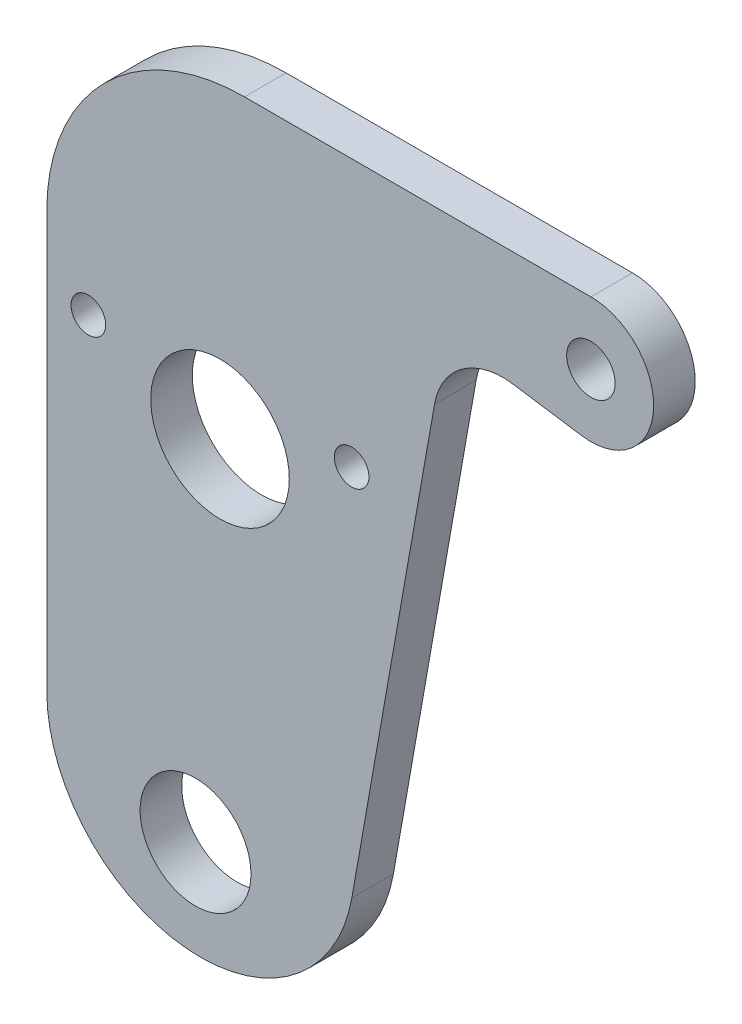
ISO-10303-21;
HEADER;
FILE_DESCRIPTION(('STEP AP214'),'2;1');
FILE_NAME('part.step','',(''),(''),'','','');
FILE_SCHEMA(('AUTOMOTIVE_DESIGN { 1 0 10303 214 1 1 1 1 }'));
ENDSEC;
DATA;
#1=APPLICATION_CONTEXT('core data for automotive mechanical design processes');
#2=APPLICATION_PROTOCOL_DEFINITION('international standard','automotive_design',2000,#1);
#3=PRODUCT_CONTEXT('',#1,'mechanical');
#4=PRODUCT('Part','Part','',(#3));
#5=PRODUCT_RELATED_PRODUCT_CATEGORY('part','',(#4));
#6=PRODUCT_DEFINITION_FORMATION('','',#4);
#7=PRODUCT_DEFINITION_CONTEXT('part definition',#1,'design');
#8=PRODUCT_DEFINITION('design','',#6,#7);
#9=PRODUCT_DEFINITION_SHAPE('','',#8);
#10=(LENGTH_UNIT() NAMED_UNIT(*) SI_UNIT(.MILLI.,.METRE.));
#11=(NAMED_UNIT(*) PLANE_ANGLE_UNIT() SI_UNIT($,.RADIAN.));
#12=(NAMED_UNIT(*) SI_UNIT($,.STERADIAN.) SOLID_ANGLE_UNIT());
#13=UNCERTAINTY_MEASURE_WITH_UNIT(LENGTH_MEASURE(1.E-05),#10,'distance_accuracy_value','');
#14=(GEOMETRIC_REPRESENTATION_CONTEXT(3) GLOBAL_UNCERTAINTY_ASSIGNED_CONTEXT((#13)) GLOBAL_UNIT_ASSIGNED_CONTEXT((#10,
#11,#12)) REPRESENTATION_CONTEXT('',''));
#15=CARTESIAN_POINT('',(0.,0.,0.));
#16=DIRECTION('',(0.,0.,1.));
#17=DIRECTION('',(1.,0.,0.));
#18=AXIS2_PLACEMENT_3D('',#15,#16,#17);
#19=CARTESIAN_POINT('',(-1.40800828095821,-15.,3.));
#20=DIRECTION('',(0.,0.,1.));
#21=DIRECTION('',(1.,0.,0.));
#22=AXIS2_PLACEMENT_3D('',#19,#20,#21);
#23=PLANE('',#22);
#24=CARTESIAN_POINT('',(26.7667788981174,24.7387140079105,3.));
#25=DIRECTION('',(0.,0.,1.));
#26=DIRECTION('',(1.,0.,0.));
#27=AXIS2_PLACEMENT_3D('',#24,#25,#26);
#28=CIRCLE('',#27,1.75);
#29=CARTESIAN_POINT('',(28.5167788981174,24.7387140079105,3.));
#30=VERTEX_POINT('',#29);
#31=EDGE_CURVE('E206',#30,#30,#28,.T.);
#32=ORIENTED_EDGE('',*,*,#31,.F.);
#33=EDGE_LOOP('',(#32));
#34=FACE_BOUND('',#33,.T.);
#35=CARTESIAN_POINT('',(-9.5,10.,3.));
#36=DIRECTION('',(0.,0.,1.));
#37=DIRECTION('',(1.,0.,0.));
#38=AXIS2_PLACEMENT_3D('',#35,#36,#37);
#39=CIRCLE('',#38,1.25);
#40=CARTESIAN_POINT('',(-8.25,10.,3.));
#41=VERTEX_POINT('',#40);
#42=EDGE_CURVE('E201',#41,#41,#39,.T.);
#43=ORIENTED_EDGE('',*,*,#42,.F.);
#44=EDGE_LOOP('',(#43));
#45=FACE_BOUND('',#44,.T.);
#46=CARTESIAN_POINT('',(9.5,10.,3.));
#47=DIRECTION('',(0.,0.,1.));
#48=DIRECTION('',(1.,0.,0.));
#49=AXIS2_PLACEMENT_3D('',#46,#47,#48);
#50=CIRCLE('',#49,1.25);
#51=CARTESIAN_POINT('',(10.75,10.,3.));
#52=VERTEX_POINT('',#51);
#53=EDGE_CURVE('E198',#52,#52,#50,.T.);
#54=ORIENTED_EDGE('',*,*,#53,.F.);
#55=EDGE_LOOP('',(#54));
#56=FACE_BOUND('',#55,.T.);
#57=CARTESIAN_POINT('',(0.,7.,3.));
#58=DIRECTION('',(0.,0.,1.));
#59=DIRECTION('',(1.,0.,0.));
#60=AXIS2_PLACEMENT_3D('',#57,#58,#59);
#61=CIRCLE('',#60,5.);
#62=CARTESIAN_POINT('',(5.,7.,3.));
#63=VERTEX_POINT('',#62);
#64=EDGE_CURVE('E191',#63,#63,#61,.T.);
#65=ORIENTED_EDGE('',*,*,#64,.F.);
#66=EDGE_LOOP('',(#65));
#67=FACE_BOUND('',#66,.T.);
#68=CARTESIAN_POINT('',(-1.40800828095821,-15.,3.));
#69=DIRECTION('',(0.,0.,1.));
#70=DIRECTION('',(1.,0.,0.));
#71=AXIS2_PLACEMENT_3D('',#68,#69,#70);
#72=CIRCLE('',#71,11.0919917190418);
#73=CARTESIAN_POINT('',(-12.5,-15.,3.));
#74=VERTEX_POINT('',#73);
#75=CARTESIAN_POINT('',(9.51547116030137,-16.9261041487082,3.));
#76=VERTEX_POINT('',#75);
#77=EDGE_CURVE('E148',#74,#76,#72,.T.);
#78=ORIENTED_EDGE('',*,*,#77,.T.);
#79=DIRECTION('',(0.173648177666924,0.984807753012209,0.));
#80=VECTOR('',#79,1.);
#81=CARTESIAN_POINT('',(15.4845288396986,16.9261041487082,3.));
#82=LINE('',#81,#80);
#83=CARTESIAN_POINT('',(15.4845288396986,16.9261041487082,3.));
#84=VERTEX_POINT('',#83);
#85=EDGE_CURVE('E96',#76,#84,#82,.T.);
#86=ORIENTED_EDGE('',*,*,#85,.T.);
#87=CARTESIAN_POINT('',(20.4085676047597,16.0578632603736,3.));
#88=DIRECTION('',(0.,0.,-1.));
#89=DIRECTION('',(1.,0.,0.));
#90=AXIS2_PLACEMENT_3D('',#87,#88,#89);
#91=CIRCLE('',#90,5.);
#92=CARTESIAN_POINT('',(21.1503450956942,21.0025337401875,3.));
#93=VERTEX_POINT('',#92);
#94=EDGE_CURVE('E163',#84,#93,#91,.T.);
#95=ORIENTED_EDGE('',*,*,#94,.T.);
#96=DIRECTION('',(0.988934095962776,-0.148355498186913,0.));
#97=VECTOR('',#96,1.);
#98=CARTESIAN_POINT('',(26.0950155755081,20.2607562492529,3.));
#99=LINE('',#98,#97);
#100=CARTESIAN_POINT('',(26.0950155755081,20.2607562492529,3.));
#101=VERTEX_POINT('',#100);
#102=EDGE_CURVE('E176',#93,#101,#99,.T.);
#103=ORIENTED_EDGE('',*,*,#102,.T.);
#104=CARTESIAN_POINT('',(26.7667788981174,24.7387140079105,3.));
#105=DIRECTION('',(0.,0.,1.));
#106=DIRECTION('',(-1.,0.,0.));
#107=AXIS2_PLACEMENT_3D('',#104,#105,#106);
#108=CIRCLE('',#107,4.52806489020693);
#109=CARTESIAN_POINT('',(26.7667788981174,29.2667788981174,3.));
#110=VERTEX_POINT('',#109);
#111=EDGE_CURVE('E115',#101,#110,#108,.T.);
#112=ORIENTED_EDGE('',*,*,#111,.T.);
#113=DIRECTION('',(-1.,0.,0.));
#114=VECTOR('',#113,1.);
#115=CARTESIAN_POINT('',(1.76677889811743,29.2667788981174,3.));
#116=LINE('',#115,#114);
#117=CARTESIAN_POINT('',(1.76677889811743,29.2667788981174,3.));
#118=VERTEX_POINT('',#117);
#119=EDGE_CURVE('E109',#110,#118,#116,.T.);
#120=ORIENTED_EDGE('',*,*,#119,.T.);
#121=CARTESIAN_POINT('',(1.76677889811743,15.,3.));
#122=DIRECTION('',(0.,0.,1.));
#123=DIRECTION('',(-1.,0.,0.));
#124=AXIS2_PLACEMENT_3D('',#121,#122,#123);
#125=CIRCLE('',#124,14.2667788981174);
#126=CARTESIAN_POINT('',(-12.5,15.,3.));
#127=VERTEX_POINT('',#126);
#128=EDGE_CURVE('E113',#118,#127,#125,.T.);
#129=ORIENTED_EDGE('',*,*,#128,.T.);
#130=DIRECTION('',(0.,-1.,0.));
#131=VECTOR('',#130,1.);
#132=CARTESIAN_POINT('',(-12.5,-15.,3.));
#133=LINE('',#132,#131);
#134=EDGE_CURVE('E53',#127,#74,#133,.T.);
#135=ORIENTED_EDGE('',*,*,#134,.T.);
#136=EDGE_LOOP('',(#78,#86,#95,#103,#112,#120,#129,#135));
#137=FACE_BOUND('',#136,.T.);
#138=CARTESIAN_POINT('',(-1.76464885854855,-19.0764204551448,3.));
#139=DIRECTION('',(0.,0.,1.));
#140=DIRECTION('',(1.,0.,0.));
#141=AXIS2_PLACEMENT_3D('',#138,#139,#140);
#142=CIRCLE('',#141,4.);
#143=CARTESIAN_POINT('',(2.23535114145145,-19.0764204551448,3.));
#144=VERTEX_POINT('',#143);
#145=EDGE_CURVE('E137',#144,#144,#142,.T.);
#146=ORIENTED_EDGE('',*,*,#145,.F.);
#147=EDGE_LOOP('',(#146));
#148=FACE_BOUND('',#147,.T.);
#149=ADVANCED_FACE('F36',(#34,#45,#56,#67,#137,#148),#23,.T.);
#150=CARTESIAN_POINT('',(-1.40800828095821,-15.,0.));
#151=DIRECTION('',(0.,0.,1.));
#152=DIRECTION('',(1.,0.,0.));
#153=AXIS2_PLACEMENT_3D('',#150,#151,#152);
#154=PLANE('',#153);
#155=CARTESIAN_POINT('',(26.7667788981174,24.7387140079105,0.));
#156=DIRECTION('',(0.,0.,1.));
#157=DIRECTION('',(1.,0.,0.));
#158=AXIS2_PLACEMENT_3D('',#155,#156,#157);
#159=CIRCLE('',#158,1.75);
#160=CARTESIAN_POINT('',(28.5167788981174,24.7387140079105,0.));
#161=VERTEX_POINT('',#160);
#162=EDGE_CURVE('E192',#161,#161,#159,.T.);
#163=ORIENTED_EDGE('',*,*,#162,.T.);
#164=EDGE_LOOP('',(#163));
#165=FACE_BOUND('',#164,.T.);
#166=CARTESIAN_POINT('',(-9.5,10.,0.));
#167=DIRECTION('',(0.,0.,1.));
#168=DIRECTION('',(1.,0.,0.));
#169=AXIS2_PLACEMENT_3D('',#166,#167,#168);
#170=CIRCLE('',#169,1.25);
#171=CARTESIAN_POINT('',(-8.25,10.,0.));
#172=VERTEX_POINT('',#171);
#173=EDGE_CURVE('E185',#172,#172,#170,.T.);
#174=ORIENTED_EDGE('',*,*,#173,.T.);
#175=EDGE_LOOP('',(#174));
#176=FACE_BOUND('',#175,.T.);
#177=CARTESIAN_POINT('',(9.5,10.,0.));
#178=DIRECTION('',(0.,0.,1.));
#179=DIRECTION('',(1.,0.,0.));
#180=AXIS2_PLACEMENT_3D('',#177,#178,#179);
#181=CIRCLE('',#180,1.25);
#182=CARTESIAN_POINT('',(10.75,10.,0.));
#183=VERTEX_POINT('',#182);
#184=EDGE_CURVE('E195',#183,#183,#181,.T.);
#185=ORIENTED_EDGE('',*,*,#184,.T.);
#186=EDGE_LOOP('',(#185));
#187=FACE_BOUND('',#186,.T.);
#188=CARTESIAN_POINT('',(0.,7.,0.));
#189=DIRECTION('',(0.,0.,1.));
#190=DIRECTION('',(1.,0.,0.));
#191=AXIS2_PLACEMENT_3D('',#188,#189,#190);
#192=CIRCLE('',#191,5.);
#193=CARTESIAN_POINT('',(5.,7.,0.));
#194=VERTEX_POINT('',#193);
#195=EDGE_CURVE('E188',#194,#194,#192,.T.);
#196=ORIENTED_EDGE('',*,*,#195,.T.);
#197=EDGE_LOOP('',(#196));
#198=FACE_BOUND('',#197,.T.);
#199=CARTESIAN_POINT('',(-1.40800828095821,-15.,0.));
#200=DIRECTION('',(0.,0.,1.));
#201=DIRECTION('',(1.,0.,0.));
#202=AXIS2_PLACEMENT_3D('',#199,#200,#201);
#203=CIRCLE('',#202,11.0919917190418);
#204=CARTESIAN_POINT('',(-12.5,-15.,0.));
#205=VERTEX_POINT('',#204);
#206=CARTESIAN_POINT('',(9.51547116030137,-16.9261041487082,0.));
#207=VERTEX_POINT('',#206);
#208=EDGE_CURVE('E133',#205,#207,#203,.T.);
#209=ORIENTED_EDGE('',*,*,#208,.F.);
#210=DIRECTION('',(0.,-1.,0.));
#211=VECTOR('',#210,1.);
#212=CARTESIAN_POINT('',(-12.5,-15.,0.));
#213=LINE('',#212,#211);
#214=CARTESIAN_POINT('',(-12.5,15.,0.));
#215=VERTEX_POINT('',#214);
#216=EDGE_CURVE('E88',#215,#205,#213,.T.);
#217=ORIENTED_EDGE('',*,*,#216,.F.);
#218=CARTESIAN_POINT('',(1.76677889811743,15.,0.));
#219=DIRECTION('',(0.,0.,1.));
#220=DIRECTION('',(-1.,0.,0.));
#221=AXIS2_PLACEMENT_3D('',#218,#219,#220);
#222=CIRCLE('',#221,14.2667788981174);
#223=CARTESIAN_POINT('',(1.76677889811743,29.2667788981174,0.));
#224=VERTEX_POINT('',#223);
#225=EDGE_CURVE('E82',#224,#215,#222,.T.);
#226=ORIENTED_EDGE('',*,*,#225,.F.);
#227=DIRECTION('',(-1.,0.,0.));
#228=VECTOR('',#227,1.);
#229=CARTESIAN_POINT('',(1.76677889811743,29.2667788981174,0.));
#230=LINE('',#229,#228);
#231=CARTESIAN_POINT('',(26.7667788981174,29.2667788981174,0.));
#232=VERTEX_POINT('',#231);
#233=EDGE_CURVE('E123',#232,#224,#230,.T.);
#234=ORIENTED_EDGE('',*,*,#233,.F.);
#235=CARTESIAN_POINT('',(26.7667788981174,24.7387140079105,0.));
#236=DIRECTION('',(0.,0.,1.));
#237=DIRECTION('',(-1.,0.,0.));
#238=AXIS2_PLACEMENT_3D('',#235,#236,#237);
#239=CIRCLE('',#238,4.52806489020693);
#240=CARTESIAN_POINT('',(26.0950155755081,20.2607562492529,0.));
#241=VERTEX_POINT('',#240);
#242=EDGE_CURVE('E143',#241,#232,#239,.T.);
#243=ORIENTED_EDGE('',*,*,#242,.F.);
#244=DIRECTION('',(0.988934095962776,-0.148355498186913,0.));
#245=VECTOR('',#244,1.);
#246=CARTESIAN_POINT('',(26.0950155755081,20.2607562492529,0.));
#247=LINE('',#246,#245);
#248=CARTESIAN_POINT('',(21.1503450956942,21.0025337401875,0.));
#249=VERTEX_POINT('',#248);
#250=EDGE_CURVE('E141',#249,#241,#247,.T.);
#251=ORIENTED_EDGE('',*,*,#250,.F.);
#252=CARTESIAN_POINT('',(20.4085676047597,16.0578632603736,0.));
#253=DIRECTION('',(0.,0.,-1.));
#254=DIRECTION('',(1.,0.,0.));
#255=AXIS2_PLACEMENT_3D('',#252,#253,#254);
#256=CIRCLE('',#255,5.);
#257=CARTESIAN_POINT('',(15.4845288396986,16.9261041487082,0.));
#258=VERTEX_POINT('',#257);
#259=EDGE_CURVE('E139',#258,#249,#256,.T.);
#260=ORIENTED_EDGE('',*,*,#259,.F.);
#261=DIRECTION('',(0.173648177666924,0.984807753012209,0.));
#262=VECTOR('',#261,1.);
#263=CARTESIAN_POINT('',(15.4845288396986,16.9261041487082,0.));
#264=LINE('',#263,#262);
#265=EDGE_CURVE('E136',#207,#258,#264,.T.);
#266=ORIENTED_EDGE('',*,*,#265,.F.);
#267=EDGE_LOOP('',(#209,#217,#226,#234,#243,#251,#260,#266));
#268=FACE_BOUND('',#267,.T.);
#269=CARTESIAN_POINT('',(-1.76464885854855,-19.0764204551448,0.));
#270=DIRECTION('',(0.,0.,1.));
#271=DIRECTION('',(1.,0.,0.));
#272=AXIS2_PLACEMENT_3D('',#269,#270,#271);
#273=CIRCLE('',#272,4.);
#274=CARTESIAN_POINT('',(2.23535114145145,-19.0764204551448,0.));
#275=VERTEX_POINT('',#274);
#276=EDGE_CURVE('E182',#275,#275,#273,.T.);
#277=ORIENTED_EDGE('',*,*,#276,.T.);
#278=EDGE_LOOP('',(#277));
#279=FACE_BOUND('',#278,.T.);
#280=ADVANCED_FACE('F167',(#165,#176,#187,#198,#268,#279),#154,.F.);
#281=CARTESIAN_POINT('',(-1.40800828095821,-15.,3.));
#282=DIRECTION('',(0.,0.,-1.));
#283=DIRECTION('',(-1.,0.,0.));
#284=AXIS2_PLACEMENT_3D('',#281,#282,#283);
#285=CYLINDRICAL_SURFACE('',#284,11.0919917190418);
#286=ORIENTED_EDGE('',*,*,#208,.T.);
#287=DIRECTION('',(0.,0.,-1.));
#288=VECTOR('',#287,1.);
#289=CARTESIAN_POINT('',(9.51547116030137,-16.9261041487082,3.));
#290=LINE('',#289,#288);
#291=EDGE_CURVE('E11',#76,#207,#290,.T.);
#292=ORIENTED_EDGE('',*,*,#291,.F.);
#293=ORIENTED_EDGE('',*,*,#77,.F.);
#294=DIRECTION('',(0.,0.,-1.));
#295=VECTOR('',#294,1.);
#296=CARTESIAN_POINT('',(-12.5,-15.,3.));
#297=LINE('',#296,#295);
#298=EDGE_CURVE('E129',#74,#205,#297,.T.);
#299=ORIENTED_EDGE('',*,*,#298,.T.);
#300=EDGE_LOOP('',(#286,#292,#293,#299));
#301=FACE_BOUND('',#300,.T.);
#302=ADVANCED_FACE('F38',(#301),#285,.T.);
#303=CARTESIAN_POINT('',(15.4845288396986,16.9261041487082,3.));
#304=DIRECTION('',(-0.984807753012209,0.173648177666924,0.));
#305=DIRECTION('',(-0.173648177666924,-0.984807753012209,0.));
#306=AXIS2_PLACEMENT_3D('',#303,#304,#305);
#307=PLANE('',#306);
#308=ORIENTED_EDGE('',*,*,#265,.T.);
#309=DIRECTION('',(0.,0.,-1.));
#310=VECTOR('',#309,1.);
#311=CARTESIAN_POINT('',(15.4845288396986,16.9261041487082,3.));
#312=LINE('',#311,#310);
#313=EDGE_CURVE('E45',#84,#258,#312,.T.);
#314=ORIENTED_EDGE('',*,*,#313,.F.);
#315=ORIENTED_EDGE('',*,*,#85,.F.);
#316=ORIENTED_EDGE('',*,*,#291,.T.);
#317=EDGE_LOOP('',(#308,#314,#315,#316));
#318=FACE_BOUND('',#317,.T.);
#319=ADVANCED_FACE('F261',(#318),#307,.F.);
#320=CARTESIAN_POINT('',(20.4085676047597,16.0578632603736,3.));
#321=DIRECTION('',(0.,0.,-1.));
#322=DIRECTION('',(-1.,0.,0.));
#323=AXIS2_PLACEMENT_3D('',#320,#321,#322);
#324=CYLINDRICAL_SURFACE('',#323,5.);
#325=ORIENTED_EDGE('',*,*,#259,.T.);
#326=DIRECTION('',(0.,0.,-1.));
#327=VECTOR('',#326,1.);
#328=CARTESIAN_POINT('',(21.1503450956942,21.0025337401875,3.));
#329=LINE('',#328,#327);
#330=EDGE_CURVE('E155',#93,#249,#329,.T.);
#331=ORIENTED_EDGE('',*,*,#330,.F.);
#332=ORIENTED_EDGE('',*,*,#94,.F.);
#333=ORIENTED_EDGE('',*,*,#313,.T.);
#334=EDGE_LOOP('',(#325,#331,#332,#333));
#335=FACE_BOUND('',#334,.T.);
#336=ADVANCED_FACE('F161',(#335),#324,.F.);
#337=CARTESIAN_POINT('',(26.0950155755081,20.2607562492529,3.));
#338=DIRECTION('',(0.148355498186913,0.988934095962776,0.));
#339=DIRECTION('',(-0.988934095962776,0.148355498186913,0.));
#340=AXIS2_PLACEMENT_3D('',#337,#338,#339);
#341=PLANE('',#340);
#342=ORIENTED_EDGE('',*,*,#250,.T.);
#343=DIRECTION('',(0.,0.,-1.));
#344=VECTOR('',#343,1.);
#345=CARTESIAN_POINT('',(26.0950155755081,20.2607562492529,3.));
#346=LINE('',#345,#344);
#347=EDGE_CURVE('E152',#101,#241,#346,.T.);
#348=ORIENTED_EDGE('',*,*,#347,.F.);
#349=ORIENTED_EDGE('',*,*,#102,.F.);
#350=ORIENTED_EDGE('',*,*,#330,.T.);
#351=EDGE_LOOP('',(#342,#348,#349,#350));
#352=FACE_BOUND('',#351,.T.);
#353=ADVANCED_FACE('F172',(#352),#341,.F.);
#354=CARTESIAN_POINT('',(26.7667788981174,24.7387140079105,3.));
#355=DIRECTION('',(0.,0.,-1.));
#356=DIRECTION('',(-1.,0.,0.));
#357=AXIS2_PLACEMENT_3D('',#354,#355,#356);
#358=CYLINDRICAL_SURFACE('',#357,4.52806489020693);
#359=ORIENTED_EDGE('',*,*,#242,.T.);
#360=DIRECTION('',(0.,0.,-1.));
#361=VECTOR('',#360,1.);
#362=CARTESIAN_POINT('',(26.7667788981174,29.2667788981174,3.));
#363=LINE('',#362,#361);
#364=EDGE_CURVE('E124',#110,#232,#363,.T.);
#365=ORIENTED_EDGE('',*,*,#364,.F.);
#366=ORIENTED_EDGE('',*,*,#111,.F.);
#367=ORIENTED_EDGE('',*,*,#347,.T.);
#368=EDGE_LOOP('',(#359,#365,#366,#367));
#369=FACE_BOUND('',#368,.T.);
#370=ADVANCED_FACE('F175',(#369),#358,.T.);
#371=CARTESIAN_POINT('',(1.76677889811743,29.2667788981174,3.));
#372=DIRECTION('',(0.,-1.,0.));
#373=DIRECTION('',(0.,0.,-1.));
#374=AXIS2_PLACEMENT_3D('',#371,#372,#373);
#375=PLANE('',#374);
#376=ORIENTED_EDGE('',*,*,#233,.T.);
#377=DIRECTION('',(0.,0.,-1.));
#378=VECTOR('',#377,1.);
#379=CARTESIAN_POINT('',(1.76677889811743,29.2667788981174,3.));
#380=LINE('',#379,#378);
#381=EDGE_CURVE('E120',#118,#224,#380,.T.);
#382=ORIENTED_EDGE('',*,*,#381,.F.);
#383=ORIENTED_EDGE('',*,*,#119,.F.);
#384=ORIENTED_EDGE('',*,*,#364,.T.);
#385=EDGE_LOOP('',(#376,#382,#383,#384));
#386=FACE_BOUND('',#385,.T.);
#387=ADVANCED_FACE('F121',(#386),#375,.F.);
#388=CARTESIAN_POINT('',(1.76677889811743,15.,3.));
#389=DIRECTION('',(0.,0.,-1.));
#390=DIRECTION('',(-1.,0.,0.));
#391=AXIS2_PLACEMENT_3D('',#388,#389,#390);
#392=CYLINDRICAL_SURFACE('',#391,14.2667788981174);
#393=ORIENTED_EDGE('',*,*,#225,.T.);
#394=DIRECTION('',(0.,0.,-1.));
#395=VECTOR('',#394,1.);
#396=CARTESIAN_POINT('',(-12.5,15.,3.));
#397=LINE('',#396,#395);
#398=EDGE_CURVE('E125',#127,#215,#397,.T.);
#399=ORIENTED_EDGE('',*,*,#398,.F.);
#400=ORIENTED_EDGE('',*,*,#128,.F.);
#401=ORIENTED_EDGE('',*,*,#381,.T.);
#402=EDGE_LOOP('',(#393,#399,#400,#401));
#403=FACE_BOUND('',#402,.T.);
#404=ADVANCED_FACE('F127',(#403),#392,.T.);
#405=CARTESIAN_POINT('',(-12.5,-15.,3.));
#406=DIRECTION('',(1.,0.,0.));
#407=DIRECTION('',(0.,1.,0.));
#408=AXIS2_PLACEMENT_3D('',#405,#406,#407);
#409=PLANE('',#408);
#410=ORIENTED_EDGE('',*,*,#216,.T.);
#411=ORIENTED_EDGE('',*,*,#298,.F.);
#412=ORIENTED_EDGE('',*,*,#134,.F.);
#413=ORIENTED_EDGE('',*,*,#398,.T.);
#414=EDGE_LOOP('',(#410,#411,#412,#413));
#415=FACE_BOUND('',#414,.T.);
#416=ADVANCED_FACE('F242',(#415),#409,.F.);
#417=CARTESIAN_POINT('',(-1.76464885854855,-19.0764204551448,3.));
#418=DIRECTION('',(0.,0.,-1.));
#419=DIRECTION('',(-1.,0.,0.));
#420=AXIS2_PLACEMENT_3D('',#417,#418,#419);
#421=CYLINDRICAL_SURFACE('',#420,4.);
#422=ORIENTED_EDGE('',*,*,#145,.T.);
#423=EDGE_LOOP('',(#422));
#424=FACE_BOUND('',#423,.T.);
#425=ORIENTED_EDGE('',*,*,#276,.F.);
#426=EDGE_LOOP('',(#425));
#427=FACE_BOUND('',#426,.T.);
#428=ADVANCED_FACE('F233',(#424,#427),#421,.F.);
#429=CARTESIAN_POINT('',(0.,7.,0.));
#430=DIRECTION('',(0.,0.,1.));
#431=DIRECTION('',(1.,0.,0.));
#432=AXIS2_PLACEMENT_3D('',#429,#430,#431);
#433=CYLINDRICAL_SURFACE('',#432,5.);
#434=ORIENTED_EDGE('',*,*,#195,.F.);
#435=EDGE_LOOP('',(#434));
#436=FACE_BOUND('',#435,.T.);
#437=ORIENTED_EDGE('',*,*,#64,.T.);
#438=EDGE_LOOP('',(#437));
#439=FACE_BOUND('',#438,.T.);
#440=ADVANCED_FACE('F230',(#436,#439),#433,.F.);
#441=CARTESIAN_POINT('',(9.5,10.,0.));
#442=DIRECTION('',(0.,0.,1.));
#443=DIRECTION('',(1.,0.,0.));
#444=AXIS2_PLACEMENT_3D('',#441,#442,#443);
#445=CYLINDRICAL_SURFACE('',#444,1.25);
#446=ORIENTED_EDGE('',*,*,#184,.F.);
#447=EDGE_LOOP('',(#446));
#448=FACE_BOUND('',#447,.T.);
#449=ORIENTED_EDGE('',*,*,#53,.T.);
#450=EDGE_LOOP('',(#449));
#451=FACE_BOUND('',#450,.T.);
#452=ADVANCED_FACE('F232',(#448,#451),#445,.F.);
#453=CARTESIAN_POINT('',(-9.5,10.,0.));
#454=DIRECTION('',(0.,0.,1.));
#455=DIRECTION('',(1.,0.,0.));
#456=AXIS2_PLACEMENT_3D('',#453,#454,#455);
#457=CYLINDRICAL_SURFACE('',#456,1.25);
#458=ORIENTED_EDGE('',*,*,#173,.F.);
#459=EDGE_LOOP('',(#458));
#460=FACE_BOUND('',#459,.T.);
#461=ORIENTED_EDGE('',*,*,#42,.T.);
#462=EDGE_LOOP('',(#461));
#463=FACE_BOUND('',#462,.T.);
#464=ADVANCED_FACE('F217',(#460,#463),#457,.F.);
#465=CARTESIAN_POINT('',(26.7667788981174,24.7387140079105,0.));
#466=DIRECTION('',(0.,0.,1.));
#467=DIRECTION('',(1.,0.,0.));
#468=AXIS2_PLACEMENT_3D('',#465,#466,#467);
#469=CYLINDRICAL_SURFACE('',#468,1.75);
#470=ORIENTED_EDGE('',*,*,#162,.F.);
#471=EDGE_LOOP('',(#470));
#472=FACE_BOUND('',#471,.T.);
#473=ORIENTED_EDGE('',*,*,#31,.T.);
#474=EDGE_LOOP('',(#473));
#475=FACE_BOUND('',#474,.T.);
#476=ADVANCED_FACE('F214',(#472,#475),#469,.F.);
#477=CLOSED_SHELL('',(#149,#280,#302,#319,#336,#353,#370,#387,#404,#416,#428,#440,#452,#464,#476));
#478=MANIFOLD_SOLID_BREP('B2',#477);
#479=ADVANCED_BREP_SHAPE_REPRESENTATION('',(#18,#478),#14);
#480=SHAPE_DEFINITION_REPRESENTATION(#9,#479);
ENDSEC;
END-ISO-10303-21;
